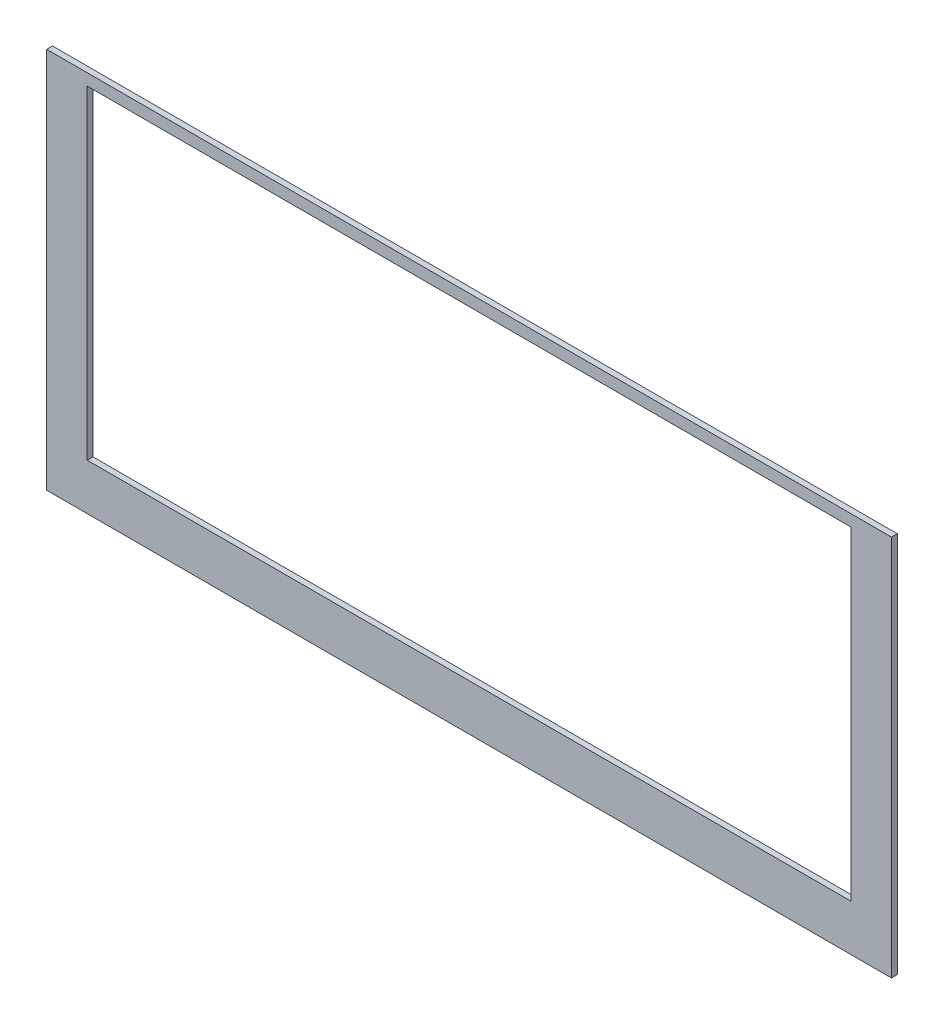
ISO-10303-21;
HEADER;
FILE_DESCRIPTION(('STEP AP214'),'2;1');
FILE_NAME('part.step','',(''),(''),'','','');
FILE_SCHEMA(('AUTOMOTIVE_DESIGN { 1 0 10303 214 1 1 1 1 }'));
ENDSEC;
DATA;
#1=APPLICATION_CONTEXT('core data for automotive mechanical design processes');
#2=APPLICATION_PROTOCOL_DEFINITION('international standard','automotive_design',2000,#1);
#3=PRODUCT_CONTEXT('',#1,'mechanical');
#4=PRODUCT('Part','Part','',(#3));
#5=PRODUCT_RELATED_PRODUCT_CATEGORY('part','',(#4));
#6=PRODUCT_DEFINITION_FORMATION('','',#4);
#7=PRODUCT_DEFINITION_CONTEXT('part definition',#1,'design');
#8=PRODUCT_DEFINITION('design','',#6,#7);
#9=PRODUCT_DEFINITION_SHAPE('','',#8);
#10=(LENGTH_UNIT() NAMED_UNIT(*) SI_UNIT(.MILLI.,.METRE.));
#11=(NAMED_UNIT(*) PLANE_ANGLE_UNIT() SI_UNIT($,.RADIAN.));
#12=(NAMED_UNIT(*) SI_UNIT($,.STERADIAN.) SOLID_ANGLE_UNIT());
#13=UNCERTAINTY_MEASURE_WITH_UNIT(LENGTH_MEASURE(1.E-05),#10,'distance_accuracy_value','');
#14=(GEOMETRIC_REPRESENTATION_CONTEXT(3) GLOBAL_UNCERTAINTY_ASSIGNED_CONTEXT((#13)) GLOBAL_UNIT_ASSIGNED_CONTEXT((#10,
#11,#12)) REPRESENTATION_CONTEXT('',''));
#15=CARTESIAN_POINT('',(0.,0.,0.));
#16=DIRECTION('',(0.,0.,1.));
#17=DIRECTION('',(1.,0.,0.));
#18=AXIS2_PLACEMENT_3D('',#15,#16,#17);
#19=CARTESIAN_POINT('',(365.,-165.,5.));
#20=DIRECTION('',(-1.,0.,0.));
#21=DIRECTION('',(0.,0.,1.));
#22=AXIS2_PLACEMENT_3D('',#19,#20,#21);
#23=PLANE('',#22);
#24=DIRECTION('',(0.,1.,0.));
#25=VECTOR('',#24,1.);
#26=CARTESIAN_POINT('',(365.,-165.,0.));
#27=LINE('',#26,#25);
#28=CARTESIAN_POINT('',(365.,-165.,0.));
#29=VERTEX_POINT('',#28);
#30=CARTESIAN_POINT('',(365.,165.,0.));
#31=VERTEX_POINT('',#30);
#32=EDGE_CURVE('E134',#29,#31,#27,.T.);
#33=ORIENTED_EDGE('',*,*,#32,.T.);
#34=DIRECTION('',(0.,0.,-1.));
#35=VECTOR('',#34,1.);
#36=CARTESIAN_POINT('',(365.,165.,5.));
#37=LINE('',#36,#35);
#38=CARTESIAN_POINT('',(365.,165.,5.));
#39=VERTEX_POINT('',#38);
#40=EDGE_CURVE('E11',#39,#31,#37,.T.);
#41=ORIENTED_EDGE('',*,*,#40,.F.);
#42=DIRECTION('',(0.,1.,0.));
#43=VECTOR('',#42,1.);
#44=CARTESIAN_POINT('',(365.,-165.,5.));
#45=LINE('',#44,#43);
#46=CARTESIAN_POINT('',(365.,-165.,5.));
#47=VERTEX_POINT('',#46);
#48=EDGE_CURVE('E135',#47,#39,#45,.T.);
#49=ORIENTED_EDGE('',*,*,#48,.F.);
#50=DIRECTION('',(0.,0.,-1.));
#51=VECTOR('',#50,1.);
#52=CARTESIAN_POINT('',(365.,-165.,5.));
#53=LINE('',#52,#51);
#54=EDGE_CURVE('E145',#47,#29,#53,.T.);
#55=ORIENTED_EDGE('',*,*,#54,.T.);
#56=EDGE_LOOP('',(#33,#41,#49,#55));
#57=FACE_BOUND('',#56,.T.);
#58=ADVANCED_FACE('F33',(#57),#23,.F.);
#59=CARTESIAN_POINT('',(-365.,165.,5.));
#60=DIRECTION('',(0.,-1.,0.));
#61=DIRECTION('',(0.,0.,-1.));
#62=AXIS2_PLACEMENT_3D('',#59,#60,#61);
#63=PLANE('',#62);
#64=DIRECTION('',(-1.,0.,0.));
#65=VECTOR('',#64,1.);
#66=CARTESIAN_POINT('',(-365.,165.,0.));
#67=LINE('',#66,#65);
#68=CARTESIAN_POINT('',(-365.,165.,0.));
#69=VERTEX_POINT('',#68);
#70=EDGE_CURVE('E148',#31,#69,#67,.T.);
#71=ORIENTED_EDGE('',*,*,#70,.T.);
#72=DIRECTION('',(0.,0.,-1.));
#73=VECTOR('',#72,1.);
#74=CARTESIAN_POINT('',(-365.,165.,5.));
#75=LINE('',#74,#73);
#76=CARTESIAN_POINT('',(-365.,165.,5.));
#77=VERTEX_POINT('',#76);
#78=EDGE_CURVE('E40',#77,#69,#75,.T.);
#79=ORIENTED_EDGE('',*,*,#78,.F.);
#80=DIRECTION('',(-1.,0.,0.));
#81=VECTOR('',#80,1.);
#82=CARTESIAN_POINT('',(-365.,165.,5.));
#83=LINE('',#82,#81);
#84=EDGE_CURVE('E138',#39,#77,#83,.T.);
#85=ORIENTED_EDGE('',*,*,#84,.F.);
#86=ORIENTED_EDGE('',*,*,#40,.T.);
#87=EDGE_LOOP('',(#71,#79,#85,#86));
#88=FACE_BOUND('',#87,.T.);
#89=ADVANCED_FACE('F176',(#88),#63,.F.);
#90=CARTESIAN_POINT('',(-365.,-165.,5.));
#91=DIRECTION('',(1.,0.,0.));
#92=DIRECTION('',(0.,0.,-1.));
#93=AXIS2_PLACEMENT_3D('',#90,#91,#92);
#94=PLANE('',#93);
#95=DIRECTION('',(0.,-1.,0.));
#96=VECTOR('',#95,1.);
#97=CARTESIAN_POINT('',(-365.,-165.,0.));
#98=LINE('',#97,#96);
#99=CARTESIAN_POINT('',(-365.,-165.,0.));
#100=VERTEX_POINT('',#99);
#101=EDGE_CURVE('E150',#69,#100,#98,.T.);
#102=ORIENTED_EDGE('',*,*,#101,.T.);
#103=DIRECTION('',(0.,0.,-1.));
#104=VECTOR('',#103,1.);
#105=CARTESIAN_POINT('',(-365.,-165.,5.));
#106=LINE('',#105,#104);
#107=CARTESIAN_POINT('',(-365.,-165.,5.));
#108=VERTEX_POINT('',#107);
#109=EDGE_CURVE('E155',#108,#100,#106,.T.);
#110=ORIENTED_EDGE('',*,*,#109,.F.);
#111=DIRECTION('',(0.,-1.,0.));
#112=VECTOR('',#111,1.);
#113=CARTESIAN_POINT('',(-365.,-165.,5.));
#114=LINE('',#113,#112);
#115=EDGE_CURVE('E141',#77,#108,#114,.T.);
#116=ORIENTED_EDGE('',*,*,#115,.F.);
#117=ORIENTED_EDGE('',*,*,#78,.T.);
#118=EDGE_LOOP('',(#102,#110,#116,#117));
#119=FACE_BOUND('',#118,.T.);
#120=ADVANCED_FACE('F162',(#119),#94,.F.);
#121=CARTESIAN_POINT('',(-365.,-165.,5.));
#122=DIRECTION('',(0.,1.,0.));
#123=DIRECTION('',(0.,0.,1.));
#124=AXIS2_PLACEMENT_3D('',#121,#122,#123);
#125=PLANE('',#124);
#126=DIRECTION('',(1.,0.,0.));
#127=VECTOR('',#126,1.);
#128=CARTESIAN_POINT('',(-365.,-165.,0.));
#129=LINE('',#128,#127);
#130=EDGE_CURVE('E139',#100,#29,#129,.T.);
#131=ORIENTED_EDGE('',*,*,#130,.T.);
#132=ORIENTED_EDGE('',*,*,#54,.F.);
#133=DIRECTION('',(1.,0.,0.));
#134=VECTOR('',#133,1.);
#135=CARTESIAN_POINT('',(-365.,-165.,5.));
#136=LINE('',#135,#134);
#137=EDGE_CURVE('E143',#108,#47,#136,.T.);
#138=ORIENTED_EDGE('',*,*,#137,.F.);
#139=ORIENTED_EDGE('',*,*,#109,.T.);
#140=EDGE_LOOP('',(#131,#132,#138,#139));
#141=FACE_BOUND('',#140,.T.);
#142=ADVANCED_FACE('F169',(#141),#125,.F.);
#143=CARTESIAN_POINT('',(0.,0.,5.));
#144=DIRECTION('',(0.,0.,-1.));
#145=DIRECTION('',(-1.,0.,0.));
#146=AXIS2_PLACEMENT_3D('',#143,#144,#145);
#147=PLANE('',#146);
#148=DIRECTION('',(0.,-1.,0.));
#149=VECTOR('',#148,1.);
#150=CARTESIAN_POINT('',(-330.,155.,5.));
#151=LINE('',#150,#149);
#152=CARTESIAN_POINT('',(-330.,155.,5.));
#153=VERTEX_POINT('',#152);
#154=CARTESIAN_POINT('',(-330.,-125.,5.));
#155=VERTEX_POINT('',#154);
#156=EDGE_CURVE('E121',#153,#155,#151,.T.);
#157=ORIENTED_EDGE('',*,*,#156,.F.);
#158=DIRECTION('',(-1.,0.,0.));
#159=VECTOR('',#158,1.);
#160=CARTESIAN_POINT('',(330.,155.,5.));
#161=LINE('',#160,#159);
#162=CARTESIAN_POINT('',(330.,155.,5.));
#163=VERTEX_POINT('',#162);
#164=EDGE_CURVE('E114',#163,#153,#161,.T.);
#165=ORIENTED_EDGE('',*,*,#164,.F.);
#166=DIRECTION('',(0.,1.,0.));
#167=VECTOR('',#166,1.);
#168=CARTESIAN_POINT('',(330.,155.,5.));
#169=LINE('',#168,#167);
#170=CARTESIAN_POINT('',(330.,-125.,5.));
#171=VERTEX_POINT('',#170);
#172=EDGE_CURVE('E125',#171,#163,#169,.T.);
#173=ORIENTED_EDGE('',*,*,#172,.F.);
#174=DIRECTION('',(1.,0.,0.));
#175=VECTOR('',#174,1.);
#176=CARTESIAN_POINT('',(330.,-125.,5.));
#177=LINE('',#176,#175);
#178=EDGE_CURVE('E47',#155,#171,#177,.T.);
#179=ORIENTED_EDGE('',*,*,#178,.F.);
#180=EDGE_LOOP('',(#157,#165,#173,#179));
#181=FACE_BOUND('',#180,.T.);
#182=ORIENTED_EDGE('',*,*,#48,.T.);
#183=ORIENTED_EDGE('',*,*,#84,.T.);
#184=ORIENTED_EDGE('',*,*,#115,.T.);
#185=ORIENTED_EDGE('',*,*,#137,.T.);
#186=EDGE_LOOP('',(#182,#183,#184,#185));
#187=FACE_BOUND('',#186,.T.);
#188=ADVANCED_FACE('F175',(#181,#187),#147,.F.);
#189=CARTESIAN_POINT('',(0.,0.,0.));
#190=DIRECTION('',(0.,0.,-1.));
#191=DIRECTION('',(-1.,0.,0.));
#192=AXIS2_PLACEMENT_3D('',#189,#190,#191);
#193=PLANE('',#192);
#194=DIRECTION('',(-1.,0.,0.));
#195=VECTOR('',#194,1.);
#196=CARTESIAN_POINT('',(330.,155.,0.));
#197=LINE('',#196,#195);
#198=CARTESIAN_POINT('',(330.,155.,0.));
#199=VERTEX_POINT('',#198);
#200=CARTESIAN_POINT('',(-330.,155.,0.));
#201=VERTEX_POINT('',#200);
#202=EDGE_CURVE('E111',#199,#201,#197,.T.);
#203=ORIENTED_EDGE('',*,*,#202,.T.);
#204=DIRECTION('',(0.,-1.,0.));
#205=VECTOR('',#204,1.);
#206=CARTESIAN_POINT('',(-330.,155.,0.));
#207=LINE('',#206,#205);
#208=CARTESIAN_POINT('',(-330.,-125.,0.));
#209=VERTEX_POINT('',#208);
#210=EDGE_CURVE('E98',#201,#209,#207,.T.);
#211=ORIENTED_EDGE('',*,*,#210,.T.);
#212=DIRECTION('',(1.,0.,0.));
#213=VECTOR('',#212,1.);
#214=CARTESIAN_POINT('',(330.,-125.,0.));
#215=LINE('',#214,#213);
#216=CARTESIAN_POINT('',(330.,-125.,0.));
#217=VERTEX_POINT('',#216);
#218=EDGE_CURVE('E129',#209,#217,#215,.T.);
#219=ORIENTED_EDGE('',*,*,#218,.T.);
#220=DIRECTION('',(0.,1.,0.));
#221=VECTOR('',#220,1.);
#222=CARTESIAN_POINT('',(330.,155.,0.));
#223=LINE('',#222,#221);
#224=EDGE_CURVE('E119',#217,#199,#223,.T.);
#225=ORIENTED_EDGE('',*,*,#224,.T.);
#226=EDGE_LOOP('',(#203,#211,#219,#225));
#227=FACE_BOUND('',#226,.T.);
#228=ORIENTED_EDGE('',*,*,#32,.F.);
#229=ORIENTED_EDGE('',*,*,#130,.F.);
#230=ORIENTED_EDGE('',*,*,#101,.F.);
#231=ORIENTED_EDGE('',*,*,#70,.F.);
#232=EDGE_LOOP('',(#228,#229,#230,#231));
#233=FACE_BOUND('',#232,.T.);
#234=ADVANCED_FACE('F117',(#227,#233),#193,.T.);
#235=CARTESIAN_POINT('',(330.,155.,-716.937933157397));
#236=DIRECTION('',(0.,1.,0.));
#237=DIRECTION('',(-1.,0.,0.));
#238=AXIS2_PLACEMENT_3D('',#235,#236,#237);
#239=PLANE('',#238);
#240=DIRECTION('',(0.,0.,1.));
#241=VECTOR('',#240,1.);
#242=CARTESIAN_POINT('',(330.,155.,-716.937933157397));
#243=LINE('',#242,#241);
#244=EDGE_CURVE('E55',#199,#163,#243,.T.);
#245=ORIENTED_EDGE('',*,*,#244,.T.);
#246=ORIENTED_EDGE('',*,*,#164,.T.);
#247=DIRECTION('',(0.,0.,1.));
#248=VECTOR('',#247,1.);
#249=CARTESIAN_POINT('',(-330.,155.,-716.937933157397));
#250=LINE('',#249,#248);
#251=EDGE_CURVE('E102',#201,#153,#250,.T.);
#252=ORIENTED_EDGE('',*,*,#251,.F.);
#253=ORIENTED_EDGE('',*,*,#202,.F.);
#254=EDGE_LOOP('',(#245,#246,#252,#253));
#255=FACE_BOUND('',#254,.T.);
#256=ADVANCED_FACE('F110',(#255),#239,.F.);
#257=CARTESIAN_POINT('',(-330.,155.,-716.937933157397));
#258=DIRECTION('',(-1.,0.,0.));
#259=DIRECTION('',(0.,-1.,0.));
#260=AXIS2_PLACEMENT_3D('',#257,#258,#259);
#261=PLANE('',#260);
#262=ORIENTED_EDGE('',*,*,#251,.T.);
#263=ORIENTED_EDGE('',*,*,#156,.T.);
#264=DIRECTION('',(0.,0.,1.));
#265=VECTOR('',#264,1.);
#266=CARTESIAN_POINT('',(-330.,-125.,-716.937933157397));
#267=LINE('',#266,#265);
#268=EDGE_CURVE('E104',#209,#155,#267,.T.);
#269=ORIENTED_EDGE('',*,*,#268,.F.);
#270=ORIENTED_EDGE('',*,*,#210,.F.);
#271=EDGE_LOOP('',(#262,#263,#269,#270));
#272=FACE_BOUND('',#271,.T.);
#273=ADVANCED_FACE('F100',(#272),#261,.F.);
#274=CARTESIAN_POINT('',(330.,-125.,-716.937933157397));
#275=DIRECTION('',(0.,-1.,0.));
#276=DIRECTION('',(1.,0.,0.));
#277=AXIS2_PLACEMENT_3D('',#274,#275,#276);
#278=PLANE('',#277);
#279=ORIENTED_EDGE('',*,*,#268,.T.);
#280=ORIENTED_EDGE('',*,*,#178,.T.);
#281=DIRECTION('',(0.,0.,1.));
#282=VECTOR('',#281,1.);
#283=CARTESIAN_POINT('',(330.,-125.,-716.937933157397));
#284=LINE('',#283,#282);
#285=EDGE_CURVE('E128',#217,#171,#284,.T.);
#286=ORIENTED_EDGE('',*,*,#285,.F.);
#287=ORIENTED_EDGE('',*,*,#218,.F.);
#288=EDGE_LOOP('',(#279,#280,#286,#287));
#289=FACE_BOUND('',#288,.T.);
#290=ADVANCED_FACE('F195',(#289),#278,.F.);
#291=CARTESIAN_POINT('',(330.,155.,-716.937933157397));
#292=DIRECTION('',(1.,0.,0.));
#293=DIRECTION('',(0.,1.,0.));
#294=AXIS2_PLACEMENT_3D('',#291,#292,#293);
#295=PLANE('',#294);
#296=ORIENTED_EDGE('',*,*,#285,.T.);
#297=ORIENTED_EDGE('',*,*,#172,.T.);
#298=ORIENTED_EDGE('',*,*,#244,.F.);
#299=ORIENTED_EDGE('',*,*,#224,.F.);
#300=EDGE_LOOP('',(#296,#297,#298,#299));
#301=FACE_BOUND('',#300,.T.);
#302=ADVANCED_FACE('F198',(#301),#295,.F.);
#303=CLOSED_SHELL('',(#58,#89,#120,#142,#188,#234,#256,#273,#290,#302));
#304=MANIFOLD_SOLID_BREP('B2',#303);
#305=ADVANCED_BREP_SHAPE_REPRESENTATION('',(#18,#304),#14);
#306=SHAPE_DEFINITION_REPRESENTATION(#9,#305);
ENDSEC;
END-ISO-10303-21;
